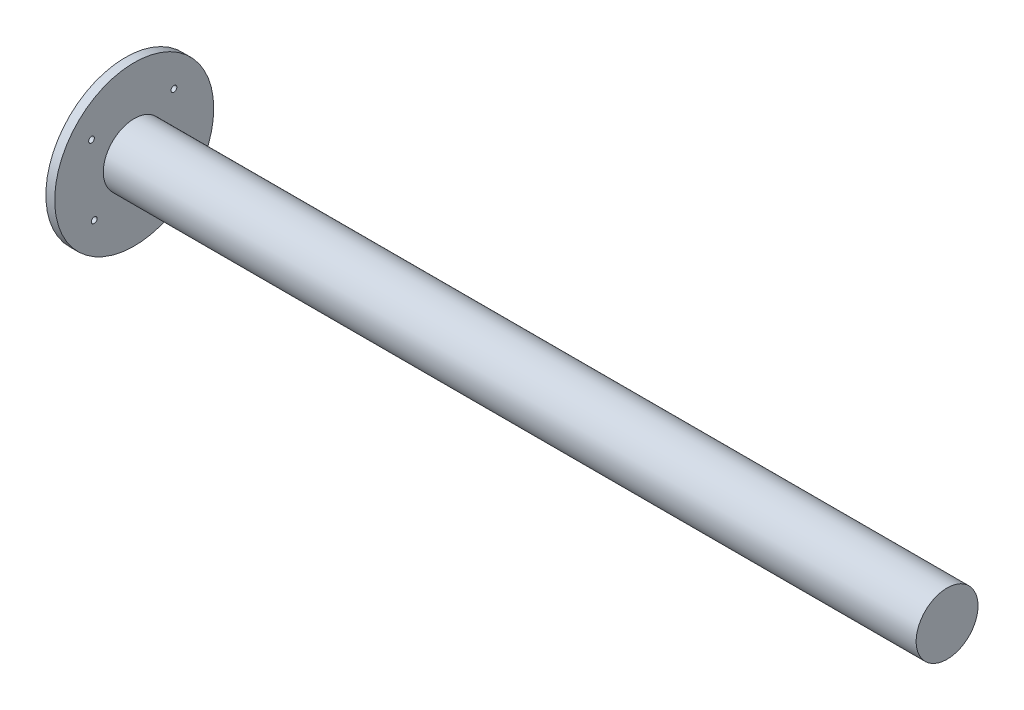
ISO-10303-21;
HEADER;
FILE_DESCRIPTION(('STEP AP214'),'2;1');
FILE_NAME('part.step','',(''),(''),'','','');
FILE_SCHEMA(('AUTOMOTIVE_DESIGN { 1 0 10303 214 1 1 1 1 }'));
ENDSEC;
DATA;
#1=APPLICATION_CONTEXT('core data for automotive mechanical design processes');
#2=APPLICATION_PROTOCOL_DEFINITION('international standard','automotive_design',2000,#1);
#3=PRODUCT_CONTEXT('',#1,'mechanical');
#4=PRODUCT('Part','Part','',(#3));
#5=PRODUCT_RELATED_PRODUCT_CATEGORY('part','',(#4));
#6=PRODUCT_DEFINITION_FORMATION('','',#4);
#7=PRODUCT_DEFINITION_CONTEXT('part definition',#1,'design');
#8=PRODUCT_DEFINITION('design','',#6,#7);
#9=PRODUCT_DEFINITION_SHAPE('','',#8);
#10=(LENGTH_UNIT() NAMED_UNIT(*) SI_UNIT(.MILLI.,.METRE.));
#11=(NAMED_UNIT(*) PLANE_ANGLE_UNIT() SI_UNIT($,.RADIAN.));
#12=(NAMED_UNIT(*) SI_UNIT($,.STERADIAN.) SOLID_ANGLE_UNIT());
#13=UNCERTAINTY_MEASURE_WITH_UNIT(LENGTH_MEASURE(1.E-05),#10,'distance_accuracy_value','');
#14=(GEOMETRIC_REPRESENTATION_CONTEXT(3) GLOBAL_UNCERTAINTY_ASSIGNED_CONTEXT((#13)) GLOBAL_UNIT_ASSIGNED_CONTEXT((#10,
#11,#12)) REPRESENTATION_CONTEXT('',''));
#15=CARTESIAN_POINT('',(0.,0.,0.));
#16=DIRECTION('',(0.,0.,1.));
#17=DIRECTION('',(1.,0.,0.));
#18=AXIS2_PLACEMENT_3D('',#15,#16,#17);
#19=CARTESIAN_POINT('',(5.,0.,0.));
#20=DIRECTION('',(-1.,0.,0.));
#21=DIRECTION('',(0.,0.,1.));
#22=AXIS2_PLACEMENT_3D('',#19,#20,#21);
#23=CYLINDRICAL_SURFACE('',#22,45.);
#24=CARTESIAN_POINT('',(5.,0.,0.));
#25=DIRECTION('',(1.,0.,0.));
#26=DIRECTION('',(0.,0.,-1.));
#27=AXIS2_PLACEMENT_3D('',#24,#25,#26);
#28=CIRCLE('',#27,45.);
#29=CARTESIAN_POINT('',(5.,0.,-45.));
#30=VERTEX_POINT('',#29);
#31=EDGE_CURVE('E44',#30,#30,#28,.T.);
#32=ORIENTED_EDGE('',*,*,#31,.F.);
#33=EDGE_LOOP('',(#32));
#34=FACE_BOUND('',#33,.T.);
#35=CARTESIAN_POINT('',(0.,0.,0.));
#36=DIRECTION('',(1.,0.,0.));
#37=DIRECTION('',(0.,0.,-1.));
#38=AXIS2_PLACEMENT_3D('',#35,#36,#37);
#39=CIRCLE('',#38,45.);
#40=CARTESIAN_POINT('',(0.,0.,-45.));
#41=VERTEX_POINT('',#40);
#42=EDGE_CURVE('E40',#41,#41,#39,.T.);
#43=ORIENTED_EDGE('',*,*,#42,.T.);
#44=EDGE_LOOP('',(#43));
#45=FACE_BOUND('',#44,.T.);
#46=ADVANCED_FACE('F37',(#34,#45),#23,.T.);
#47=CARTESIAN_POINT('',(5.,0.,0.));
#48=DIRECTION('',(1.,0.,0.));
#49=DIRECTION('',(0.,0.,-1.));
#50=AXIS2_PLACEMENT_3D('',#47,#48,#49);
#51=PLANE('',#50);
#52=CARTESIAN_POINT('',(5.,19.2536751309556,24.1682848781543));
#53=DIRECTION('',(-1.,0.,0.));
#54=DIRECTION('',(0.,0.,1.));
#55=AXIS2_PLACEMENT_3D('',#52,#53,#54);
#56=CIRCLE('',#55,1.63195);
#57=CARTESIAN_POINT('',(5.,19.2536751309556,25.8002348781543));
#58=VERTEX_POINT('',#57);
#59=EDGE_CURVE('E71',#58,#58,#56,.T.);
#60=ORIENTED_EDGE('',*,*,#59,.T.);
#61=EDGE_LOOP('',(#60));
#62=FACE_BOUND('',#61,.T.);
#63=CARTESIAN_POINT('',(5.,20.8424278243257,-22.4861913713233));
#64=DIRECTION('',(-1.,0.,0.));
#65=DIRECTION('',(0.,0.,1.));
#66=AXIS2_PLACEMENT_3D('',#63,#64,#65);
#67=CIRCLE('',#66,1.63195);
#68=CARTESIAN_POINT('',(5.,20.8424278243257,-20.8542413713233));
#69=VERTEX_POINT('',#68);
#70=EDGE_CURVE('E65',#69,#69,#67,.T.);
#71=ORIENTED_EDGE('',*,*,#70,.T.);
#72=EDGE_LOOP('',(#71));
#73=FACE_BOUND('',#72,.T.);
#74=CARTESIAN_POINT('',(5.,-19.4670537583711,-23.7903639730184));
#75=DIRECTION('',(-1.,0.,0.));
#76=DIRECTION('',(0.,0.,1.));
#77=AXIS2_PLACEMENT_3D('',#74,#75,#76);
#78=CIRCLE('',#77,1.63195);
#79=CARTESIAN_POINT('',(5.,-19.4670537583711,-22.1584139730184));
#80=VERTEX_POINT('',#79);
#81=EDGE_CURVE('E59',#80,#80,#78,.T.);
#82=ORIENTED_EDGE('',*,*,#81,.T.);
#83=EDGE_LOOP('',(#82));
#84=FACE_BOUND('',#83,.T.);
#85=CARTESIAN_POINT('',(5.,-20.9783862576221,22.6328723326496));
#86=DIRECTION('',(-1.,0.,0.));
#87=DIRECTION('',(0.,0.,1.));
#88=AXIS2_PLACEMENT_3D('',#85,#86,#87);
#89=CIRCLE('',#88,1.63195);
#90=CARTESIAN_POINT('',(5.,-20.9783862576221,24.2648223326496));
#91=VERTEX_POINT('',#90);
#92=EDGE_CURVE('E53',#91,#91,#89,.T.);
#93=ORIENTED_EDGE('',*,*,#92,.T.);
#94=EDGE_LOOP('',(#93));
#95=FACE_BOUND('',#94,.T.);
#96=CARTESIAN_POINT('',(5.,0.,0.));
#97=DIRECTION('',(1.,0.,0.));
#98=DIRECTION('',(0.,0.,-1.));
#99=AXIS2_PLACEMENT_3D('',#96,#97,#98);
#100=CIRCLE('',#99,17.5);
#101=CARTESIAN_POINT('',(5.,0.,-17.5));
#102=VERTEX_POINT('',#101);
#103=EDGE_CURVE('E10',#102,#102,#100,.T.);
#104=ORIENTED_EDGE('',*,*,#103,.F.);
#105=EDGE_LOOP('',(#104));
#106=FACE_BOUND('',#105,.T.);
#107=ORIENTED_EDGE('',*,*,#31,.T.);
#108=EDGE_LOOP('',(#107));
#109=FACE_BOUND('',#108,.T.);
#110=ADVANCED_FACE('F84',(#62,#73,#84,#95,#106,#109),#51,.T.);
#111=CARTESIAN_POINT('',(0.,0.,0.));
#112=DIRECTION('',(1.,0.,0.));
#113=DIRECTION('',(0.,0.,-1.));
#114=AXIS2_PLACEMENT_3D('',#111,#112,#113);
#115=PLANE('',#114);
#116=CARTESIAN_POINT('',(0.,19.2536751309556,24.1682848781543));
#117=DIRECTION('',(-1.,0.,0.));
#118=DIRECTION('',(0.,0.,1.));
#119=AXIS2_PLACEMENT_3D('',#116,#117,#118);
#120=CIRCLE('',#119,1.63194999999999);
#121=CARTESIAN_POINT('',(0.,19.2536751309556,25.8002348781543));
#122=VERTEX_POINT('',#121);
#123=EDGE_CURVE('E74',#122,#122,#120,.T.);
#124=ORIENTED_EDGE('',*,*,#123,.F.);
#125=EDGE_LOOP('',(#124));
#126=FACE_BOUND('',#125,.T.);
#127=CARTESIAN_POINT('',(0.,20.8424278243257,-22.4861913713233));
#128=DIRECTION('',(-1.,0.,0.));
#129=DIRECTION('',(0.,0.,1.));
#130=AXIS2_PLACEMENT_3D('',#127,#128,#129);
#131=CIRCLE('',#130,1.63194999999999);
#132=CARTESIAN_POINT('',(0.,20.8424278243257,-20.8542413713233));
#133=VERTEX_POINT('',#132);
#134=EDGE_CURVE('E68',#133,#133,#131,.T.);
#135=ORIENTED_EDGE('',*,*,#134,.F.);
#136=EDGE_LOOP('',(#135));
#137=FACE_BOUND('',#136,.T.);
#138=CARTESIAN_POINT('',(0.,-19.4670537583711,-23.7903639730184));
#139=DIRECTION('',(-1.,0.,0.));
#140=DIRECTION('',(0.,0.,1.));
#141=AXIS2_PLACEMENT_3D('',#138,#139,#140);
#142=CIRCLE('',#141,1.63194999999999);
#143=CARTESIAN_POINT('',(0.,-19.4670537583711,-22.1584139730184));
#144=VERTEX_POINT('',#143);
#145=EDGE_CURVE('E62',#144,#144,#142,.T.);
#146=ORIENTED_EDGE('',*,*,#145,.F.);
#147=EDGE_LOOP('',(#146));
#148=FACE_BOUND('',#147,.T.);
#149=CARTESIAN_POINT('',(0.,-20.9783862576221,22.6328723326496));
#150=DIRECTION('',(-1.,0.,0.));
#151=DIRECTION('',(0.,0.,1.));
#152=AXIS2_PLACEMENT_3D('',#149,#150,#151);
#153=CIRCLE('',#152,1.63194999999999);
#154=CARTESIAN_POINT('',(0.,-20.9783862576221,24.2648223326496));
#155=VERTEX_POINT('',#154);
#156=EDGE_CURVE('E56',#155,#155,#153,.T.);
#157=ORIENTED_EDGE('',*,*,#156,.F.);
#158=EDGE_LOOP('',(#157));
#159=FACE_BOUND('',#158,.T.);
#160=ORIENTED_EDGE('',*,*,#42,.F.);
#161=EDGE_LOOP('',(#160));
#162=FACE_BOUND('',#161,.T.);
#163=ADVANCED_FACE('F80',(#126,#137,#148,#159,#162),#115,.F.);
#164=CARTESIAN_POINT('',(465.,0.,0.));
#165=DIRECTION('',(-1.,0.,0.));
#166=DIRECTION('',(0.,0.,1.));
#167=AXIS2_PLACEMENT_3D('',#164,#165,#166);
#168=CYLINDRICAL_SURFACE('',#167,17.5);
#169=CARTESIAN_POINT('',(465.,0.,0.));
#170=DIRECTION('',(1.,0.,0.));
#171=DIRECTION('',(0.,0.,-1.));
#172=AXIS2_PLACEMENT_3D('',#169,#170,#171);
#173=CIRCLE('',#172,17.5);
#174=CARTESIAN_POINT('',(465.,0.,-17.5));
#175=VERTEX_POINT('',#174);
#176=EDGE_CURVE('E50',#175,#175,#173,.T.);
#177=ORIENTED_EDGE('',*,*,#176,.F.);
#178=EDGE_LOOP('',(#177));
#179=FACE_BOUND('',#178,.T.);
#180=ORIENTED_EDGE('',*,*,#103,.T.);
#181=EDGE_LOOP('',(#180));
#182=FACE_BOUND('',#181,.T.);
#183=ADVANCED_FACE('F83',(#179,#182),#168,.T.);
#184=CARTESIAN_POINT('',(465.,0.,0.));
#185=DIRECTION('',(1.,0.,0.));
#186=DIRECTION('',(0.,0.,-1.));
#187=AXIS2_PLACEMENT_3D('',#184,#185,#186);
#188=PLANE('',#187);
#189=ORIENTED_EDGE('',*,*,#176,.T.);
#190=EDGE_LOOP('',(#189));
#191=FACE_BOUND('',#190,.T.);
#192=ADVANCED_FACE('F110',(#191),#188,.T.);
#193=CARTESIAN_POINT('',(0.,-20.9783862576221,22.6328723326496));
#194=DIRECTION('',(-1.,0.,0.));
#195=DIRECTION('',(0.,0.,1.));
#196=AXIS2_PLACEMENT_3D('',#193,#194,#195);
#197=CYLINDRICAL_SURFACE('',#196,1.63194999999999);
#198=ORIENTED_EDGE('',*,*,#92,.F.);
#199=EDGE_LOOP('',(#198));
#200=FACE_BOUND('',#199,.T.);
#201=ORIENTED_EDGE('',*,*,#156,.T.);
#202=EDGE_LOOP('',(#201));
#203=FACE_BOUND('',#202,.T.);
#204=ADVANCED_FACE('F113',(#200,#203),#197,.F.);
#205=CARTESIAN_POINT('',(0.,-19.4670537583711,-23.7903639730184));
#206=DIRECTION('',(-1.,0.,0.));
#207=DIRECTION('',(0.,0.,1.));
#208=AXIS2_PLACEMENT_3D('',#205,#206,#207);
#209=CYLINDRICAL_SURFACE('',#208,1.63194999999999);
#210=ORIENTED_EDGE('',*,*,#81,.F.);
#211=EDGE_LOOP('',(#210));
#212=FACE_BOUND('',#211,.T.);
#213=ORIENTED_EDGE('',*,*,#145,.T.);
#214=EDGE_LOOP('',(#213));
#215=FACE_BOUND('',#214,.T.);
#216=ADVANCED_FACE('F117',(#212,#215),#209,.F.);
#217=CARTESIAN_POINT('',(0.,20.8424278243257,-22.4861913713233));
#218=DIRECTION('',(-1.,0.,0.));
#219=DIRECTION('',(0.,0.,1.));
#220=AXIS2_PLACEMENT_3D('',#217,#218,#219);
#221=CYLINDRICAL_SURFACE('',#220,1.63194999999999);
#222=ORIENTED_EDGE('',*,*,#70,.F.);
#223=EDGE_LOOP('',(#222));
#224=FACE_BOUND('',#223,.T.);
#225=ORIENTED_EDGE('',*,*,#134,.T.);
#226=EDGE_LOOP('',(#225));
#227=FACE_BOUND('',#226,.T.);
#228=ADVANCED_FACE('F121',(#224,#227),#221,.F.);
#229=CARTESIAN_POINT('',(0.,19.2536751309556,24.1682848781543));
#230=DIRECTION('',(-1.,0.,0.));
#231=DIRECTION('',(0.,0.,1.));
#232=AXIS2_PLACEMENT_3D('',#229,#230,#231);
#233=CYLINDRICAL_SURFACE('',#232,1.63194999999999);
#234=ORIENTED_EDGE('',*,*,#59,.F.);
#235=EDGE_LOOP('',(#234));
#236=FACE_BOUND('',#235,.T.);
#237=ORIENTED_EDGE('',*,*,#123,.T.);
#238=EDGE_LOOP('',(#237));
#239=FACE_BOUND('',#238,.T.);
#240=ADVANCED_FACE('F78',(#236,#239),#233,.F.);
#241=CLOSED_SHELL('',(#46,#110,#163,#183,#192,#204,#216,#228,#240));
#242=MANIFOLD_SOLID_BREP('B2',#241);
#243=ADVANCED_BREP_SHAPE_REPRESENTATION('',(#18,#242),#14);
#244=SHAPE_DEFINITION_REPRESENTATION(#9,#243);
ENDSEC;
END-ISO-10303-21;
